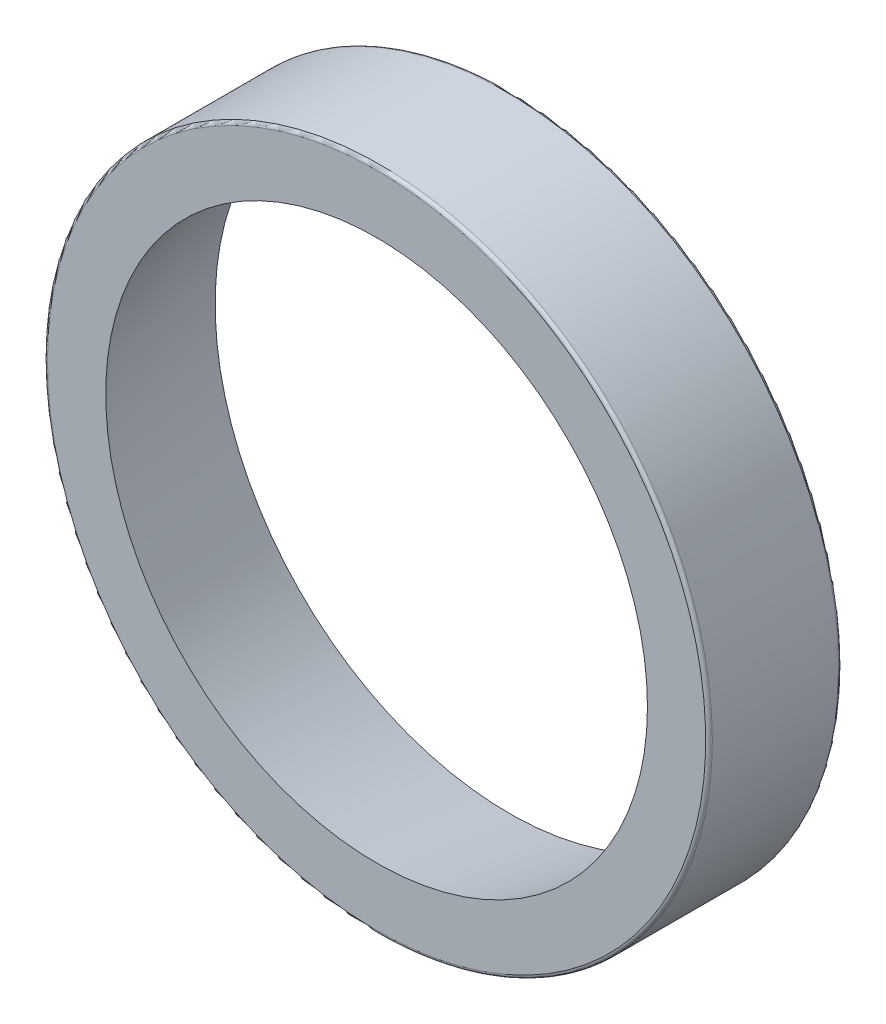
ISO-10303-21;
HEADER;
FILE_DESCRIPTION(('STEP AP214'),'2;1');
FILE_NAME('part.step','',(''),(''),'','','');
FILE_SCHEMA(('AUTOMOTIVE_DESIGN { 1 0 10303 214 1 1 1 1 }'));
ENDSEC;
DATA;
#1=APPLICATION_CONTEXT('core data for automotive mechanical design processes');
#2=APPLICATION_PROTOCOL_DEFINITION('international standard','automotive_design',2000,#1);
#3=PRODUCT_CONTEXT('',#1,'mechanical');
#4=PRODUCT('Part','Part','',(#3));
#5=PRODUCT_RELATED_PRODUCT_CATEGORY('part','',(#4));
#6=PRODUCT_DEFINITION_FORMATION('','',#4);
#7=PRODUCT_DEFINITION_CONTEXT('part definition',#1,'design');
#8=PRODUCT_DEFINITION('design','',#6,#7);
#9=PRODUCT_DEFINITION_SHAPE('','',#8);
#10=(LENGTH_UNIT() NAMED_UNIT(*) SI_UNIT(.MILLI.,.METRE.));
#11=(NAMED_UNIT(*) PLANE_ANGLE_UNIT() SI_UNIT($,.RADIAN.));
#12=(NAMED_UNIT(*) SI_UNIT($,.STERADIAN.) SOLID_ANGLE_UNIT());
#13=UNCERTAINTY_MEASURE_WITH_UNIT(LENGTH_MEASURE(1.E-05),#10,'distance_accuracy_value','');
#14=(GEOMETRIC_REPRESENTATION_CONTEXT(3) GLOBAL_UNCERTAINTY_ASSIGNED_CONTEXT((#13)) GLOBAL_UNIT_ASSIGNED_CONTEXT((#10,
#11,#12)) REPRESENTATION_CONTEXT('',''));
#15=CARTESIAN_POINT('',(0.,0.,0.));
#16=DIRECTION('',(0.,0.,1.));
#17=DIRECTION('',(1.,0.,0.));
#18=AXIS2_PLACEMENT_3D('',#15,#16,#17);
#19=CARTESIAN_POINT('',(0.,24.08936,8.334375));
#20=DIRECTION('',(0.,0.,-1.));
#21=DIRECTION('',(-1.,0.,0.));
#22=AXIS2_PLACEMENT_3D('',#19,#20,#21);
#23=PLANE('',#22);
#24=CARTESIAN_POINT('',(0.,0.,8.334375));
#25=DIRECTION('',(0.,0.,-1.));
#26=DIRECTION('',(-1.,0.,0.));
#27=AXIS2_PLACEMENT_3D('',#24,#25,#26);
#28=CIRCLE('',#27,29.270325);
#29=CARTESIAN_POINT('',(-29.270325,0.,8.334375));
#30=VERTEX_POINT('',#29);
#31=EDGE_CURVE('E10',#30,#30,#28,.F.);
#32=ORIENTED_EDGE('',*,*,#31,.T.);
#33=EDGE_LOOP('',(#32));
#34=FACE_BOUND('',#33,.T.);
#35=CARTESIAN_POINT('',(0.,0.,8.334375));
#36=DIRECTION('',(0.,0.,1.));
#37=DIRECTION('',(1.,0.,0.));
#38=AXIS2_PLACEMENT_3D('',#35,#36,#37);
#39=CIRCLE('',#38,24.08936);
#40=CARTESIAN_POINT('',(24.08936,0.,8.334375));
#41=VERTEX_POINT('',#40);
#42=EDGE_CURVE('E52',#41,#41,#39,.T.);
#43=ORIENTED_EDGE('',*,*,#42,.F.);
#44=EDGE_LOOP('',(#43));
#45=FACE_BOUND('',#44,.T.);
#46=ADVANCED_FACE('F29',(#34,#45),#23,.F.);
#47=CARTESIAN_POINT('',(0.,0.,8.334375));
#48=DIRECTION('',(0.,0.,1.));
#49=DIRECTION('',(1.,0.,0.));
#50=AXIS2_PLACEMENT_3D('',#47,#48,#49);
#51=CYLINDRICAL_SURFACE('',#50,29.5656);
#52=CARTESIAN_POINT('',(0.,0.,-3.18135));
#53=DIRECTION('',(0.,0.,1.));
#54=DIRECTION('',(1.,0.,0.));
#55=AXIS2_PLACEMENT_3D('',#52,#53,#54);
#56=CIRCLE('',#55,29.5656);
#57=CARTESIAN_POINT('',(29.5656,0.,-3.18135));
#58=VERTEX_POINT('',#57);
#59=EDGE_CURVE('E40',#58,#58,#56,.T.);
#60=ORIENTED_EDGE('',*,*,#59,.T.);
#61=EDGE_LOOP('',(#60));
#62=FACE_BOUND('',#61,.T.);
#63=CARTESIAN_POINT('',(0.,0.,8.0391));
#64=DIRECTION('',(0.,0.,-1.));
#65=DIRECTION('',(-1.,0.,0.));
#66=AXIS2_PLACEMENT_3D('',#63,#64,#65);
#67=CIRCLE('',#66,29.5656);
#68=CARTESIAN_POINT('',(-29.5656,0.,8.0391));
#69=VERTEX_POINT('',#68);
#70=EDGE_CURVE('E44',#69,#69,#67,.T.);
#71=ORIENTED_EDGE('',*,*,#70,.T.);
#72=EDGE_LOOP('',(#71));
#73=FACE_BOUND('',#72,.T.);
#74=ADVANCED_FACE('F59',(#62,#73),#51,.T.);
#75=CARTESIAN_POINT('',(0.,29.5656,-3.476625));
#76=DIRECTION('',(0.,0.,1.));
#77=DIRECTION('',(1.,0.,0.));
#78=AXIS2_PLACEMENT_3D('',#75,#76,#77);
#79=PLANE('',#78);
#80=CARTESIAN_POINT('',(0.,0.,-3.476625));
#81=DIRECTION('',(0.,0.,1.));
#82=DIRECTION('',(1.,0.,0.));
#83=AXIS2_PLACEMENT_3D('',#80,#81,#82);
#84=CIRCLE('',#83,29.270325);
#85=CARTESIAN_POINT('',(29.270325,0.,-3.476625));
#86=VERTEX_POINT('',#85);
#87=EDGE_CURVE('E36',#86,#86,#84,.F.);
#88=ORIENTED_EDGE('',*,*,#87,.T.);
#89=EDGE_LOOP('',(#88));
#90=FACE_BOUND('',#89,.T.);
#91=CARTESIAN_POINT('',(0.,0.,-3.476625));
#92=DIRECTION('',(0.,0.,1.));
#93=DIRECTION('',(1.,0.,0.));
#94=AXIS2_PLACEMENT_3D('',#91,#92,#93);
#95=CIRCLE('',#94,26.1719579691476);
#96=CARTESIAN_POINT('',(26.1719579691476,0.,-3.476625));
#97=VERTEX_POINT('',#96);
#98=EDGE_CURVE('E49',#97,#97,#95,.T.);
#99=ORIENTED_EDGE('',*,*,#98,.T.);
#100=EDGE_LOOP('',(#99));
#101=FACE_BOUND('',#100,.T.);
#102=ADVANCED_FACE('F64',(#90,#101),#79,.F.);
#103=CARTESIAN_POINT('',(0.,0.,8.334375));
#104=DIRECTION('',(0.,0.,-1.));
#105=DIRECTION('',(-1.,0.,0.));
#106=AXIS2_PLACEMENT_3D('',#103,#104,#105);
#107=CONICAL_SURFACE('',#106,24.08936,0.17453292519943);
#108=ORIENTED_EDGE('',*,*,#98,.F.);
#109=EDGE_LOOP('',(#108));
#110=FACE_BOUND('',#109,.T.);
#111=ORIENTED_EDGE('',*,*,#42,.T.);
#112=EDGE_LOOP('',(#111));
#113=FACE_BOUND('',#112,.T.);
#114=ADVANCED_FACE('F56',(#110,#113),#107,.F.);
#115=CARTESIAN_POINT('',(0.,0.,-3.18135));
#116=DIRECTION('',(0.,0.,1.));
#117=DIRECTION('',(1.,0.,0.));
#118=AXIS2_PLACEMENT_3D('',#115,#116,#117);
#119=TOROIDAL_SURFACE('',#118,29.270325,0.295275);
#120=ORIENTED_EDGE('',*,*,#87,.F.);
#121=EDGE_LOOP('',(#120));
#122=FACE_BOUND('',#121,.T.);
#123=ORIENTED_EDGE('',*,*,#59,.F.);
#124=EDGE_LOOP('',(#123));
#125=FACE_BOUND('',#124,.T.);
#126=ADVANCED_FACE('F68',(#122,#125),#119,.T.);
#127=CARTESIAN_POINT('',(0.,0.,8.0391));
#128=DIRECTION('',(0.,0.,-1.));
#129=DIRECTION('',(-1.,0.,0.));
#130=AXIS2_PLACEMENT_3D('',#127,#128,#129);
#131=TOROIDAL_SURFACE('',#130,29.270325,0.295275);
#132=ORIENTED_EDGE('',*,*,#70,.F.);
#133=EDGE_LOOP('',(#132));
#134=FACE_BOUND('',#133,.T.);
#135=ORIENTED_EDGE('',*,*,#31,.F.);
#136=EDGE_LOOP('',(#135));
#137=FACE_BOUND('',#136,.T.);
#138=ADVANCED_FACE('F31',(#134,#137),#131,.T.);
#139=CLOSED_SHELL('',(#46,#74,#102,#114,#126,#138));
#140=MANIFOLD_SOLID_BREP('B2',#139);
#141=ADVANCED_BREP_SHAPE_REPRESENTATION('',(#18,#140),#14);
#142=SHAPE_DEFINITION_REPRESENTATION(#9,#141);
ENDSEC;
END-ISO-10303-21;
